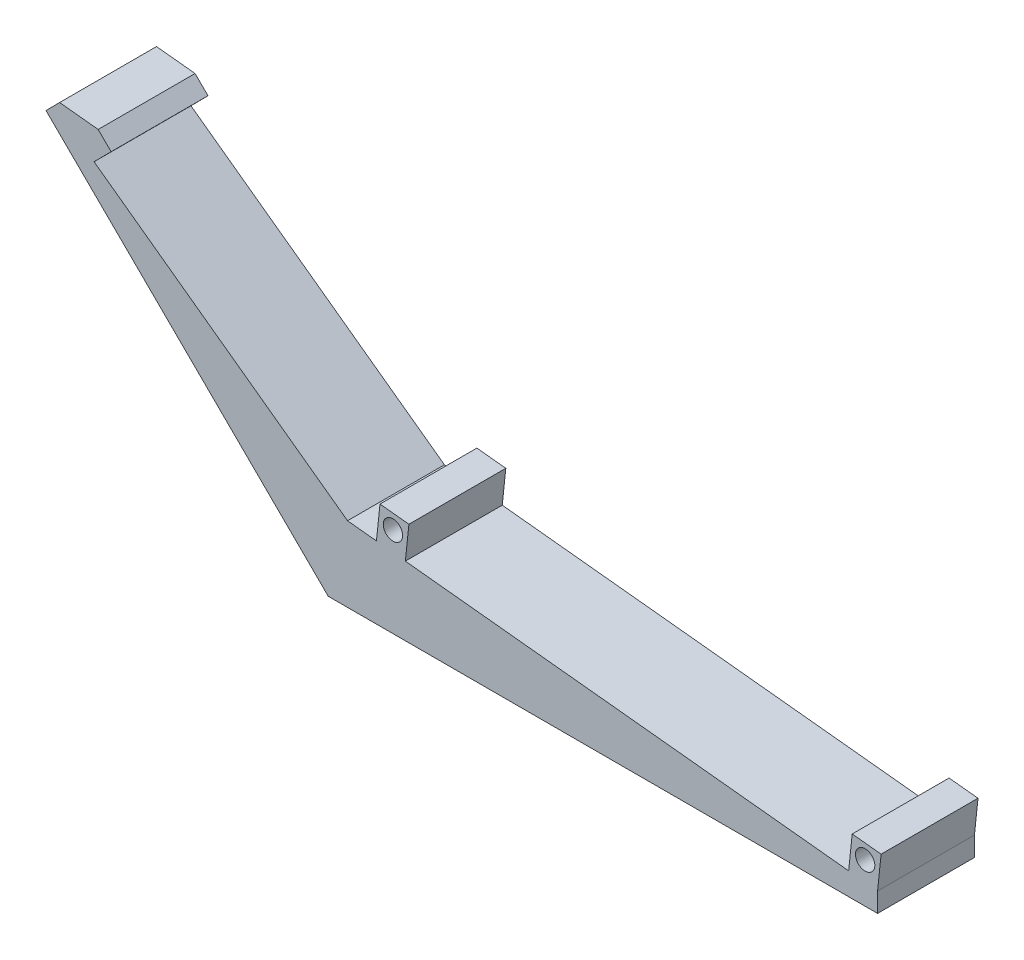
ISO-10303-21;
HEADER;
FILE_DESCRIPTION(('STEP AP214'),'2;1');
FILE_NAME('part.step','',(''),(''),'','','');
FILE_SCHEMA(('AUTOMOTIVE_DESIGN { 1 0 10303 214 1 1 1 1 }'));
ENDSEC;
DATA;
#1=APPLICATION_CONTEXT('core data for automotive mechanical design processes');
#2=APPLICATION_PROTOCOL_DEFINITION('international standard','automotive_design',2000,#1);
#3=PRODUCT_CONTEXT('',#1,'mechanical');
#4=PRODUCT('Part','Part','',(#3));
#5=PRODUCT_RELATED_PRODUCT_CATEGORY('part','',(#4));
#6=PRODUCT_DEFINITION_FORMATION('','',#4);
#7=PRODUCT_DEFINITION_CONTEXT('part definition',#1,'design');
#8=PRODUCT_DEFINITION('design','',#6,#7);
#9=PRODUCT_DEFINITION_SHAPE('','',#8);
#10=(LENGTH_UNIT() NAMED_UNIT(*) SI_UNIT(.MILLI.,.METRE.));
#11=(NAMED_UNIT(*) PLANE_ANGLE_UNIT() SI_UNIT($,.RADIAN.));
#12=(NAMED_UNIT(*) SI_UNIT($,.STERADIAN.) SOLID_ANGLE_UNIT());
#13=UNCERTAINTY_MEASURE_WITH_UNIT(LENGTH_MEASURE(1.E-05),#10,'distance_accuracy_value','');
#14=(GEOMETRIC_REPRESENTATION_CONTEXT(3) GLOBAL_UNCERTAINTY_ASSIGNED_CONTEXT((#13)) GLOBAL_UNIT_ASSIGNED_CONTEXT((#10,
#11,#12)) REPRESENTATION_CONTEXT('',''));
#15=CARTESIAN_POINT('',(0.,0.,0.));
#16=DIRECTION('',(0.,0.,1.));
#17=DIRECTION('',(1.,0.,0.));
#18=AXIS2_PLACEMENT_3D('',#15,#16,#17);
#19=CARTESIAN_POINT('',(0.,0.,10.));
#20=DIRECTION('',(0.,0.,1.));
#21=DIRECTION('',(1.,0.,0.));
#22=AXIS2_PLACEMENT_3D('',#19,#20,#21);
#23=PLANE('',#22);
#24=CARTESIAN_POINT('',(55.403938134922,4.14583648563804,10.));
#25=DIRECTION('',(0.,0.,1.));
#26=DIRECTION('',(1.,0.,0.));
#27=AXIS2_PLACEMENT_3D('',#24,#25,#26);
#28=CIRCLE('',#27,0.999999999999998);
#29=CARTESIAN_POINT('',(56.403938134922,4.14583648563804,10.));
#30=VERTEX_POINT('',#29);
#31=EDGE_CURVE('E183',#30,#30,#28,.T.);
#32=ORIENTED_EDGE('',*,*,#31,.F.);
#33=EDGE_LOOP('',(#32));
#34=FACE_BOUND('',#33,.T.);
#35=DIRECTION('',(0.71049553819604,-0.703701705414673,0.));
#36=VECTOR('',#35,1.);
#37=CARTESIAN_POINT('',(-29.1303170660377,28.8517699220016,10.));
#38=LINE('',#37,#36);
#39=CARTESIAN_POINT('',(-29.1303170660377,28.8517699220016,10.));
#40=VERTEX_POINT('',#39);
#41=CARTESIAN_POINT('',(0.,0.,10.));
#42=VERTEX_POINT('',#41);
#43=EDGE_CURVE('E214',#40,#42,#38,.T.);
#44=ORIENTED_EDGE('',*,*,#43,.T.);
#45=DIRECTION('',(1.,0.,0.));
#46=VECTOR('',#45,1.);
#47=CARTESIAN_POINT('',(0.,0.,10.));
#48=LINE('',#47,#46);
#49=CARTESIAN_POINT('',(56.6866640514391,0.,10.));
#50=VERTEX_POINT('',#49);
#51=EDGE_CURVE('E118',#42,#50,#48,.T.);
#52=ORIENTED_EDGE('',*,*,#51,.T.);
#53=DIRECTION('',(0.,1.,0.));
#54=VECTOR('',#53,1.);
#55=CARTESIAN_POINT('',(56.6866640514391,0.,10.));
#56=LINE('',#55,#54);
#57=CARTESIAN_POINT('',(56.6866640514391,2.,10.));
#58=VERTEX_POINT('',#57);
#59=EDGE_CURVE('E253',#50,#58,#56,.T.);
#60=ORIENTED_EDGE('',*,*,#59,.T.);
#61=DIRECTION('',(0.104528463267646,0.994521895368274,0.));
#62=VECTOR('',#61,1.);
#63=CARTESIAN_POINT('',(56.8957209779744,3.98904379073655,10.));
#64=LINE('',#63,#62);
#65=CARTESIAN_POINT('',(57.0525136728759,5.48082663378898,10.));
#66=VERTEX_POINT('',#65);
#67=EDGE_CURVE('E270',#58,#66,#64,.T.);
#68=ORIENTED_EDGE('',*,*,#67,.T.);
#69=DIRECTION('',(-0.994521895368274,0.104528463267647,0.));
#70=VECTOR('',#69,1.);
#71=CARTESIAN_POINT('',(54.0689479867711,5.79441202359192,10.));
#72=LINE('',#71,#70);
#73=CARTESIAN_POINT('',(54.0689479867711,5.79441202359192,10.));
#74=VERTEX_POINT('',#73);
#75=EDGE_CURVE('E267',#66,#74,#72,.T.);
#76=ORIENTED_EDGE('',*,*,#75,.T.);
#77=DIRECTION('',(-0.104528463267653,-0.994521895368273,0.));
#78=VECTOR('',#77,1.);
#79=CARTESIAN_POINT('',(53.9121552918696,4.30262918053952,10.));
#80=LINE('',#79,#78);
#81=CARTESIAN_POINT('',(53.7030983653343,2.31358538980296,10.));
#82=VERTEX_POINT('',#81);
#83=EDGE_CURVE('E269',#74,#82,#80,.T.);
#84=ORIENTED_EDGE('',*,*,#83,.T.);
#85=DIRECTION('',(-0.994521895368274,0.104528463267646,0.));
#86=VECTOR('',#85,1.);
#87=CARTESIAN_POINT('',(53.7030983653343,2.31358538980296,10.));
#88=LINE('',#87,#86);
#89=CARTESIAN_POINT('',(7.95509117839359,7.12189470011471,10.));
#90=VERTEX_POINT('',#89);
#91=EDGE_CURVE('E272',#82,#90,#88,.T.);
#92=ORIENTED_EDGE('',*,*,#91,.T.);
#93=DIRECTION('',(0.104528463267647,0.994521895368274,0.));
#94=VECTOR('',#93,1.);
#95=CARTESIAN_POINT('',(8.16414810492889,9.11093849085126,10.));
#96=LINE('',#95,#94);
#97=CARTESIAN_POINT('',(8.32094079983043,10.6027213339036,10.));
#98=VERTEX_POINT('',#97);
#99=EDGE_CURVE('E278',#90,#98,#96,.T.);
#100=ORIENTED_EDGE('',*,*,#99,.T.);
#101=DIRECTION('',(-0.994521895368274,0.104528463267645,0.));
#102=VECTOR('',#101,1.);
#103=CARTESIAN_POINT('',(5.33737511372561,10.9163067237066,10.));
#104=LINE('',#103,#102);
#105=CARTESIAN_POINT('',(5.33737511372561,10.9163067237066,10.));
#106=VERTEX_POINT('',#105);
#107=EDGE_CURVE('E280',#98,#106,#104,.T.);
#108=ORIENTED_EDGE('',*,*,#107,.T.);
#109=DIRECTION('',(-0.104528463267699,-0.994521895368269,0.));
#110=VECTOR('',#109,1.);
#111=CARTESIAN_POINT('',(5.18058241882406,9.42452388065419,10.));
#112=LINE('',#111,#110);
#113=CARTESIAN_POINT('',(4.97152549228877,7.43548008991765,10.));
#114=VERTEX_POINT('',#113);
#115=EDGE_CURVE('E282',#106,#114,#112,.T.);
#116=ORIENTED_EDGE('',*,*,#115,.T.);
#117=DIRECTION('',(-0.994521895368275,0.104528463267639,0.));
#118=VECTOR('',#117,1.);
#119=CARTESIAN_POINT('',(4.97152549228877,7.43548008991765,10.));
#120=LINE('',#119,#118);
#121=CARTESIAN_POINT('',(1.98795980618404,7.74906547972055,10.));
#122=VERTEX_POINT('',#121);
#123=EDGE_CURVE('E284',#114,#122,#120,.T.);
#124=ORIENTED_EDGE('',*,*,#123,.T.);
#125=DIRECTION('',(-0.809016994374951,0.587785252292468,0.));
#126=VECTOR('',#125,1.);
#127=CARTESIAN_POINT('',(1.98795980618404,7.74906547972055,10.));
#128=LINE('',#127,#126);
#129=CARTESIAN_POINT('',(-24.1704359642281,26.7542524713203,10.));
#130=VERTEX_POINT('',#129);
#131=EDGE_CURVE('E286',#122,#130,#128,.T.);
#132=ORIENTED_EDGE('',*,*,#131,.T.);
#133=DIRECTION('',(0.703701705414673,0.71049553819604,0.));
#134=VECTOR('',#133,1.);
#135=CARTESIAN_POINT('',(-24.1704359642281,26.7542524713203,10.));
#136=LINE('',#135,#134);
#137=CARTESIAN_POINT('',(-22.4111817006914,28.5304913168104,10.));
#138=VERTEX_POINT('',#137);
#139=EDGE_CURVE('E161',#130,#138,#136,.T.);
#140=ORIENTED_EDGE('',*,*,#139,.T.);
#141=DIRECTION('',(-0.71049553819604,0.703701705414673,0.));
#142=VECTOR('',#141,1.);
#143=CARTESIAN_POINT('',(-23.7464579497616,29.8529995144779,10.));
#144=LINE('',#143,#142);
#145=CARTESIAN_POINT('',(-23.7464579497616,29.8529995144779,10.));
#146=VERTEX_POINT('',#145);
#147=EDGE_CURVE('E155',#138,#146,#144,.T.);
#148=ORIENTED_EDGE('',*,*,#147,.T.);
#149=DIRECTION('',(-0.994521895368274,0.104528463267646,0.));
#150=VECTOR('',#149,1.);
#151=CARTESIAN_POINT('',(-27.7245455312347,30.2711133675484,10.));
#152=LINE('',#151,#150);
#153=CARTESIAN_POINT('',(-27.7245455312347,30.2711133675484,10.));
#154=VERTEX_POINT('',#153);
#155=EDGE_CURVE('E159',#146,#154,#152,.T.);
#156=ORIENTED_EDGE('',*,*,#155,.T.);
#157=DIRECTION('',(-0.703701705414674,-0.710495538196039,0.));
#158=VECTOR('',#157,1.);
#159=CARTESIAN_POINT('',(-29.1303170660377,28.8517699220016,10.));
#160=LINE('',#159,#158);
#161=EDGE_CURVE('E51',#154,#40,#160,.T.);
#162=ORIENTED_EDGE('',*,*,#161,.T.);
#163=EDGE_LOOP('',(#44,#52,#60,#68,#76,#84,#92,#100,#108,#116,#124,#132,#140,#148,#156,#162));
#164=FACE_BOUND('',#163,.T.);
#165=CARTESIAN_POINT('',(6.67236526187648,9.26773118575272,10.));
#166=DIRECTION('',(0.,0.,1.));
#167=DIRECTION('',(1.,0.,0.));
#168=AXIS2_PLACEMENT_3D('',#165,#166,#167);
#169=CIRCLE('',#168,1.);
#170=CARTESIAN_POINT('',(7.67236526187648,9.26773118575272,10.));
#171=VERTEX_POINT('',#170);
#172=EDGE_CURVE('E328',#171,#171,#169,.T.);
#173=ORIENTED_EDGE('',*,*,#172,.F.);
#174=EDGE_LOOP('',(#173));
#175=FACE_BOUND('',#174,.T.);
#176=ADVANCED_FACE('F34',(#34,#164,#175),#23,.T.);
#177=CARTESIAN_POINT('',(0.,0.,0.));
#178=DIRECTION('',(0.,0.,1.));
#179=DIRECTION('',(1.,0.,0.));
#180=AXIS2_PLACEMENT_3D('',#177,#178,#179);
#181=PLANE('',#180);
#182=DIRECTION('',(0.71049553819604,-0.703701705414673,0.));
#183=VECTOR('',#182,1.);
#184=CARTESIAN_POINT('',(-29.1303170660377,28.8517699220016,0.));
#185=LINE('',#184,#183);
#186=CARTESIAN_POINT('',(-29.1303170660377,28.8517699220016,0.));
#187=VERTEX_POINT('',#186);
#188=CARTESIAN_POINT('',(0.,0.,0.));
#189=VERTEX_POINT('',#188);
#190=EDGE_CURVE('E179',#187,#189,#185,.T.);
#191=ORIENTED_EDGE('',*,*,#190,.F.);
#192=DIRECTION('',(-0.703701705414674,-0.710495538196039,0.));
#193=VECTOR('',#192,1.);
#194=CARTESIAN_POINT('',(-29.1303170660377,28.8517699220016,0.));
#195=LINE('',#194,#193);
#196=CARTESIAN_POINT('',(-27.7245455312347,30.2711133675484,0.));
#197=VERTEX_POINT('',#196);
#198=EDGE_CURVE('E110',#197,#187,#195,.T.);
#199=ORIENTED_EDGE('',*,*,#198,.F.);
#200=DIRECTION('',(-0.994521895368274,0.104528463267646,0.));
#201=VECTOR('',#200,1.);
#202=CARTESIAN_POINT('',(-27.7245455312347,30.2711133675484,0.));
#203=LINE('',#202,#201);
#204=CARTESIAN_POINT('',(-23.7464579497616,29.8529995144779,0.));
#205=VERTEX_POINT('',#204);
#206=EDGE_CURVE('E104',#205,#197,#203,.T.);
#207=ORIENTED_EDGE('',*,*,#206,.F.);
#208=DIRECTION('',(-0.71049553819604,0.703701705414673,0.));
#209=VECTOR('',#208,1.);
#210=CARTESIAN_POINT('',(-23.7464579497616,29.8529995144779,0.));
#211=LINE('',#210,#209);
#212=CARTESIAN_POINT('',(-22.4111817006914,28.5304913168104,0.));
#213=VERTEX_POINT('',#212);
#214=EDGE_CURVE('E169',#213,#205,#211,.T.);
#215=ORIENTED_EDGE('',*,*,#214,.F.);
#216=DIRECTION('',(0.703701705414673,0.71049553819604,0.));
#217=VECTOR('',#216,1.);
#218=CARTESIAN_POINT('',(-24.1704359642281,26.7542524713203,0.));
#219=LINE('',#218,#217);
#220=CARTESIAN_POINT('',(-24.1704359642281,26.7542524713203,0.));
#221=VERTEX_POINT('',#220);
#222=EDGE_CURVE('E209',#221,#213,#219,.T.);
#223=ORIENTED_EDGE('',*,*,#222,.F.);
#224=DIRECTION('',(-0.809016994374951,0.587785252292468,0.));
#225=VECTOR('',#224,1.);
#226=CARTESIAN_POINT('',(1.98795980618404,7.74906547972055,0.));
#227=LINE('',#226,#225);
#228=CARTESIAN_POINT('',(1.98795980618404,7.74906547972055,0.));
#229=VERTEX_POINT('',#228);
#230=EDGE_CURVE('E207',#229,#221,#227,.T.);
#231=ORIENTED_EDGE('',*,*,#230,.F.);
#232=DIRECTION('',(-0.994521895368275,0.104528463267639,0.));
#233=VECTOR('',#232,1.);
#234=CARTESIAN_POINT('',(4.97152549228877,7.43548008991765,0.));
#235=LINE('',#234,#233);
#236=CARTESIAN_POINT('',(4.97152549228877,7.43548008991765,0.));
#237=VERTEX_POINT('',#236);
#238=EDGE_CURVE('E205',#237,#229,#235,.T.);
#239=ORIENTED_EDGE('',*,*,#238,.F.);
#240=DIRECTION('',(-0.104528463267646,-0.994521895368274,0.));
#241=VECTOR('',#240,1.);
#242=CARTESIAN_POINT('',(4.97152549228877,7.43548008991765,0.));
#243=LINE('',#242,#241);
#244=CARTESIAN_POINT('',(5.33737511372561,10.9163067237066,0.));
#245=VERTEX_POINT('',#244);
#246=EDGE_CURVE('E203',#245,#237,#243,.T.);
#247=ORIENTED_EDGE('',*,*,#246,.F.);
#248=DIRECTION('',(-0.994521895368274,0.104528463267645,0.));
#249=VECTOR('',#248,1.);
#250=CARTESIAN_POINT('',(5.33737511372561,10.9163067237066,0.));
#251=LINE('',#250,#249);
#252=CARTESIAN_POINT('',(8.32094079983043,10.6027213339036,0.));
#253=VERTEX_POINT('',#252);
#254=EDGE_CURVE('E200',#253,#245,#251,.T.);
#255=ORIENTED_EDGE('',*,*,#254,.F.);
#256=DIRECTION('',(0.104528463267698,0.994521895368269,0.));
#257=VECTOR('',#256,1.);
#258=CARTESIAN_POINT('',(8.32094079983043,10.6027213339036,0.));
#259=LINE('',#258,#257);
#260=CARTESIAN_POINT('',(7.95509117839359,7.12189470011471,0.));
#261=VERTEX_POINT('',#260);
#262=EDGE_CURVE('E198',#261,#253,#259,.T.);
#263=ORIENTED_EDGE('',*,*,#262,.F.);
#264=DIRECTION('',(-0.994521895368274,0.104528463267646,0.));
#265=VECTOR('',#264,1.);
#266=CARTESIAN_POINT('',(53.7030983653343,2.31358538980296,0.));
#267=LINE('',#266,#265);
#268=CARTESIAN_POINT('',(53.7030983653343,2.31358538980296,0.));
#269=VERTEX_POINT('',#268);
#270=EDGE_CURVE('E195',#269,#261,#267,.T.);
#271=ORIENTED_EDGE('',*,*,#270,.F.);
#272=DIRECTION('',(-0.104528463267646,-0.994521895368274,0.));
#273=VECTOR('',#272,1.);
#274=CARTESIAN_POINT('',(53.7030983653343,2.31358538980296,0.));
#275=LINE('',#274,#273);
#276=CARTESIAN_POINT('',(54.0689479867711,5.79441202359192,0.));
#277=VERTEX_POINT('',#276);
#278=EDGE_CURVE('E193',#277,#269,#275,.T.);
#279=ORIENTED_EDGE('',*,*,#278,.F.);
#280=DIRECTION('',(-0.994521895368274,0.104528463267647,0.));
#281=VECTOR('',#280,1.);
#282=CARTESIAN_POINT('',(54.0689479867711,5.79441202359192,0.));
#283=LINE('',#282,#281);
#284=CARTESIAN_POINT('',(57.0525136728759,5.48082663378898,0.));
#285=VERTEX_POINT('',#284);
#286=EDGE_CURVE('E190',#285,#277,#283,.T.);
#287=ORIENTED_EDGE('',*,*,#286,.F.);
#288=DIRECTION('',(0.104528463267647,0.994521895368274,0.));
#289=VECTOR('',#288,1.);
#290=CARTESIAN_POINT('',(57.0525136728759,5.48082663378898,0.));
#291=LINE('',#290,#289);
#292=CARTESIAN_POINT('',(56.6866640514391,2.,0.));
#293=VERTEX_POINT('',#292);
#294=EDGE_CURVE('E188',#293,#285,#291,.T.);
#295=ORIENTED_EDGE('',*,*,#294,.F.);
#296=DIRECTION('',(0.,1.,0.));
#297=VECTOR('',#296,1.);
#298=CARTESIAN_POINT('',(56.6866640514391,0.,0.));
#299=LINE('',#298,#297);
#300=CARTESIAN_POINT('',(56.6866640514391,0.,0.));
#301=VERTEX_POINT('',#300);
#302=EDGE_CURVE('E185',#301,#293,#299,.T.);
#303=ORIENTED_EDGE('',*,*,#302,.F.);
#304=DIRECTION('',(1.,0.,0.));
#305=VECTOR('',#304,1.);
#306=CARTESIAN_POINT('',(0.,0.,0.));
#307=LINE('',#306,#305);
#308=EDGE_CURVE('E182',#189,#301,#307,.T.);
#309=ORIENTED_EDGE('',*,*,#308,.F.);
#310=EDGE_LOOP('',(#191,#199,#207,#215,#223,#231,#239,#247,#255,#263,#271,#279,#287,#295,#303,#309));
#311=FACE_BOUND('',#310,.T.);
#312=CARTESIAN_POINT('',(55.403938134922,4.14583648563804,0.));
#313=DIRECTION('',(0.,0.,1.));
#314=DIRECTION('',(1.,0.,0.));
#315=AXIS2_PLACEMENT_3D('',#312,#313,#314);
#316=CIRCLE('',#315,0.999999999999998);
#317=CARTESIAN_POINT('',(56.403938134922,4.14583648563804,0.));
#318=VERTEX_POINT('',#317);
#319=EDGE_CURVE('E334',#318,#318,#316,.T.);
#320=ORIENTED_EDGE('',*,*,#319,.T.);
#321=EDGE_LOOP('',(#320));
#322=FACE_BOUND('',#321,.T.);
#323=CARTESIAN_POINT('',(6.67236526187648,9.26773118575272,0.));
#324=DIRECTION('',(0.,0.,1.));
#325=DIRECTION('',(1.,0.,0.));
#326=AXIS2_PLACEMENT_3D('',#323,#324,#325);
#327=CIRCLE('',#326,1.);
#328=CARTESIAN_POINT('',(7.67236526187648,9.26773118575272,0.));
#329=VERTEX_POINT('',#328);
#330=EDGE_CURVE('E331',#329,#329,#327,.T.);
#331=ORIENTED_EDGE('',*,*,#330,.T.);
#332=EDGE_LOOP('',(#331));
#333=FACE_BOUND('',#332,.T.);
#334=ADVANCED_FACE('F256',(#311,#322,#333),#181,.F.);
#335=CARTESIAN_POINT('',(-29.1303170660377,28.8517699220016,10.));
#336=DIRECTION('',(0.703701705414673,0.71049553819604,0.));
#337=DIRECTION('',(-0.71049553819604,0.703701705414673,0.));
#338=AXIS2_PLACEMENT_3D('',#335,#336,#337);
#339=PLANE('',#338);
#340=ORIENTED_EDGE('',*,*,#190,.T.);
#341=DIRECTION('',(0.,0.,-1.));
#342=VECTOR('',#341,1.);
#343=CARTESIAN_POINT('',(0.,0.,10.));
#344=LINE('',#343,#342);
#345=EDGE_CURVE('E11',#42,#189,#344,.T.);
#346=ORIENTED_EDGE('',*,*,#345,.F.);
#347=ORIENTED_EDGE('',*,*,#43,.F.);
#348=DIRECTION('',(0.,0.,-1.));
#349=VECTOR('',#348,1.);
#350=CARTESIAN_POINT('',(-29.1303170660377,28.8517699220016,10.));
#351=LINE('',#350,#349);
#352=EDGE_CURVE('E175',#40,#187,#351,.T.);
#353=ORIENTED_EDGE('',*,*,#352,.T.);
#354=EDGE_LOOP('',(#340,#346,#347,#353));
#355=FACE_BOUND('',#354,.T.);
#356=ADVANCED_FACE('F36',(#355),#339,.F.);
#357=CARTESIAN_POINT('',(0.,0.,10.));
#358=DIRECTION('',(0.,1.,0.));
#359=DIRECTION('',(0.,0.,1.));
#360=AXIS2_PLACEMENT_3D('',#357,#358,#359);
#361=PLANE('',#360);
#362=ORIENTED_EDGE('',*,*,#308,.T.);
#363=DIRECTION('',(0.,0.,-1.));
#364=VECTOR('',#363,1.);
#365=CARTESIAN_POINT('',(56.6866640514391,0.,10.));
#366=LINE('',#365,#364);
#367=EDGE_CURVE('E43',#50,#301,#366,.T.);
#368=ORIENTED_EDGE('',*,*,#367,.F.);
#369=ORIENTED_EDGE('',*,*,#51,.F.);
#370=ORIENTED_EDGE('',*,*,#345,.T.);
#371=EDGE_LOOP('',(#362,#368,#369,#370));
#372=FACE_BOUND('',#371,.T.);
#373=ADVANCED_FACE('F471',(#372),#361,.F.);
#374=CARTESIAN_POINT('',(56.6866640514391,0.,10.));
#375=DIRECTION('',(-1.,0.,0.));
#376=DIRECTION('',(0.,0.,1.));
#377=AXIS2_PLACEMENT_3D('',#374,#375,#376);
#378=PLANE('',#377);
#379=ORIENTED_EDGE('',*,*,#302,.T.);
#380=DIRECTION('',(0.,0.,-1.));
#381=VECTOR('',#380,1.);
#382=CARTESIAN_POINT('',(56.6866640514391,2.,10.));
#383=LINE('',#382,#381);
#384=EDGE_CURVE('E245',#58,#293,#383,.T.);
#385=ORIENTED_EDGE('',*,*,#384,.F.);
#386=ORIENTED_EDGE('',*,*,#59,.F.);
#387=ORIENTED_EDGE('',*,*,#367,.T.);
#388=EDGE_LOOP('',(#379,#385,#386,#387));
#389=FACE_BOUND('',#388,.T.);
#390=ADVANCED_FACE('F251',(#389),#378,.F.);
#391=CARTESIAN_POINT('',(57.0525136728759,5.48082663378898,10.));
#392=DIRECTION('',(-0.994521895368274,0.104528463267647,0.));
#393=DIRECTION('',(-0.104528463267647,-0.994521895368274,0.));
#394=AXIS2_PLACEMENT_3D('',#391,#392,#393);
#395=PLANE('',#394);
#396=ORIENTED_EDGE('',*,*,#294,.T.);
#397=DIRECTION('',(0.,0.,-1.));
#398=VECTOR('',#397,1.);
#399=CARTESIAN_POINT('',(57.0525136728759,5.48082663378898,10.));
#400=LINE('',#399,#398);
#401=EDGE_CURVE('E242',#66,#285,#400,.T.);
#402=ORIENTED_EDGE('',*,*,#401,.F.);
#403=ORIENTED_EDGE('',*,*,#67,.F.);
#404=ORIENTED_EDGE('',*,*,#384,.T.);
#405=EDGE_LOOP('',(#396,#402,#403,#404));
#406=FACE_BOUND('',#405,.T.);
#407=ADVANCED_FACE('F261',(#406),#395,.F.);
#408=CARTESIAN_POINT('',(54.0689479867711,5.79441202359192,10.));
#409=DIRECTION('',(-0.104528463267647,-0.994521895368274,0.));
#410=DIRECTION('',(0.994521895368274,-0.104528463267647,0.));
#411=AXIS2_PLACEMENT_3D('',#408,#409,#410);
#412=PLANE('',#411);
#413=ORIENTED_EDGE('',*,*,#286,.T.);
#414=DIRECTION('',(0.,0.,-1.));
#415=VECTOR('',#414,1.);
#416=CARTESIAN_POINT('',(54.0689479867711,5.79441202359192,10.));
#417=LINE('',#416,#415);
#418=EDGE_CURVE('E239',#74,#277,#417,.T.);
#419=ORIENTED_EDGE('',*,*,#418,.F.);
#420=ORIENTED_EDGE('',*,*,#75,.F.);
#421=ORIENTED_EDGE('',*,*,#401,.T.);
#422=EDGE_LOOP('',(#413,#419,#420,#421));
#423=FACE_BOUND('',#422,.T.);
#424=ADVANCED_FACE('F265',(#423),#412,.F.);
#425=CARTESIAN_POINT('',(53.7030983653343,2.31358538980296,10.));
#426=DIRECTION('',(0.994521895368274,-0.104528463267646,0.));
#427=DIRECTION('',(0.104528463267646,0.994521895368274,0.));
#428=AXIS2_PLACEMENT_3D('',#425,#426,#427);
#429=PLANE('',#428);
#430=ORIENTED_EDGE('',*,*,#278,.T.);
#431=DIRECTION('',(0.,0.,-1.));
#432=VECTOR('',#431,1.);
#433=CARTESIAN_POINT('',(53.7030983653343,2.31358538980296,10.));
#434=LINE('',#433,#432);
#435=EDGE_CURVE('E236',#82,#269,#434,.T.);
#436=ORIENTED_EDGE('',*,*,#435,.F.);
#437=ORIENTED_EDGE('',*,*,#83,.F.);
#438=ORIENTED_EDGE('',*,*,#418,.T.);
#439=EDGE_LOOP('',(#430,#436,#437,#438));
#440=FACE_BOUND('',#439,.T.);
#441=ADVANCED_FACE('F434',(#440),#429,.F.);
#442=CARTESIAN_POINT('',(53.7030983653343,2.31358538980296,10.));
#443=DIRECTION('',(-0.104528463267646,-0.994521895368274,0.));
#444=DIRECTION('',(0.994521895368274,-0.104528463267646,0.));
#445=AXIS2_PLACEMENT_3D('',#442,#443,#444);
#446=PLANE('',#445);
#447=ORIENTED_EDGE('',*,*,#270,.T.);
#448=DIRECTION('',(0.,0.,-1.));
#449=VECTOR('',#448,1.);
#450=CARTESIAN_POINT('',(7.95509117839359,7.12189470011471,10.));
#451=LINE('',#450,#449);
#452=EDGE_CURVE('E233',#90,#261,#451,.T.);
#453=ORIENTED_EDGE('',*,*,#452,.F.);
#454=ORIENTED_EDGE('',*,*,#91,.F.);
#455=ORIENTED_EDGE('',*,*,#435,.T.);
#456=EDGE_LOOP('',(#447,#453,#454,#455));
#457=FACE_BOUND('',#456,.T.);
#458=ADVANCED_FACE('F423',(#457),#446,.F.);
#459=CARTESIAN_POINT('',(8.32094079983043,10.6027213339036,10.));
#460=DIRECTION('',(-0.994521895368269,0.104528463267698,0.));
#461=DIRECTION('',(-0.104528463267698,-0.994521895368269,0.));
#462=AXIS2_PLACEMENT_3D('',#459,#460,#461);
#463=PLANE('',#462);
#464=ORIENTED_EDGE('',*,*,#262,.T.);
#465=DIRECTION('',(0.,0.,-1.));
#466=VECTOR('',#465,1.);
#467=CARTESIAN_POINT('',(8.32094079983043,10.6027213339036,10.));
#468=LINE('',#467,#466);
#469=EDGE_CURVE('E230',#98,#253,#468,.T.);
#470=ORIENTED_EDGE('',*,*,#469,.F.);
#471=ORIENTED_EDGE('',*,*,#99,.F.);
#472=ORIENTED_EDGE('',*,*,#452,.T.);
#473=EDGE_LOOP('',(#464,#470,#471,#472));
#474=FACE_BOUND('',#473,.T.);
#475=ADVANCED_FACE('F413',(#474),#463,.F.);
#476=CARTESIAN_POINT('',(5.33737511372561,10.9163067237066,10.));
#477=DIRECTION('',(-0.104528463267645,-0.994521895368274,0.));
#478=DIRECTION('',(0.994521895368274,-0.104528463267645,0.));
#479=AXIS2_PLACEMENT_3D('',#476,#477,#478);
#480=PLANE('',#479);
#481=ORIENTED_EDGE('',*,*,#254,.T.);
#482=DIRECTION('',(0.,0.,-1.));
#483=VECTOR('',#482,1.);
#484=CARTESIAN_POINT('',(5.33737511372561,10.9163067237066,10.));
#485=LINE('',#484,#483);
#486=EDGE_CURVE('E227',#106,#245,#485,.T.);
#487=ORIENTED_EDGE('',*,*,#486,.F.);
#488=ORIENTED_EDGE('',*,*,#107,.F.);
#489=ORIENTED_EDGE('',*,*,#469,.T.);
#490=EDGE_LOOP('',(#481,#487,#488,#489));
#491=FACE_BOUND('',#490,.T.);
#492=ADVANCED_FACE('F402',(#491),#480,.F.);
#493=CARTESIAN_POINT('',(4.97152549228877,7.43548008991765,10.));
#494=DIRECTION('',(0.994521895368274,-0.104528463267646,0.));
#495=DIRECTION('',(0.104528463267646,0.994521895368274,0.));
#496=AXIS2_PLACEMENT_3D('',#493,#494,#495);
#497=PLANE('',#496);
#498=ORIENTED_EDGE('',*,*,#246,.T.);
#499=DIRECTION('',(0.,0.,-1.));
#500=VECTOR('',#499,1.);
#501=CARTESIAN_POINT('',(4.97152549228877,7.43548008991765,10.));
#502=LINE('',#501,#500);
#503=EDGE_CURVE('E224',#114,#237,#502,.T.);
#504=ORIENTED_EDGE('',*,*,#503,.F.);
#505=ORIENTED_EDGE('',*,*,#115,.F.);
#506=ORIENTED_EDGE('',*,*,#486,.T.);
#507=EDGE_LOOP('',(#498,#504,#505,#506));
#508=FACE_BOUND('',#507,.T.);
#509=ADVANCED_FACE('F392',(#508),#497,.F.);
#510=CARTESIAN_POINT('',(4.97152549228877,7.43548008991765,10.));
#511=DIRECTION('',(-0.104528463267639,-0.994521895368275,0.));
#512=DIRECTION('',(0.994521895368275,-0.104528463267639,0.));
#513=AXIS2_PLACEMENT_3D('',#510,#511,#512);
#514=PLANE('',#513);
#515=ORIENTED_EDGE('',*,*,#238,.T.);
#516=DIRECTION('',(0.,0.,-1.));
#517=VECTOR('',#516,1.);
#518=CARTESIAN_POINT('',(1.98795980618404,7.74906547972055,10.));
#519=LINE('',#518,#517);
#520=EDGE_CURVE('E221',#122,#229,#519,.T.);
#521=ORIENTED_EDGE('',*,*,#520,.F.);
#522=ORIENTED_EDGE('',*,*,#123,.F.);
#523=ORIENTED_EDGE('',*,*,#503,.T.);
#524=EDGE_LOOP('',(#515,#521,#522,#523));
#525=FACE_BOUND('',#524,.T.);
#526=ADVANCED_FACE('F383',(#525),#514,.F.);
#527=CARTESIAN_POINT('',(1.98795980618404,7.74906547972055,10.));
#528=DIRECTION('',(-0.587785252292468,-0.809016994374951,0.));
#529=DIRECTION('',(0.809016994374951,-0.587785252292468,0.));
#530=AXIS2_PLACEMENT_3D('',#527,#528,#529);
#531=PLANE('',#530);
#532=ORIENTED_EDGE('',*,*,#230,.T.);
#533=DIRECTION('',(0.,0.,-1.));
#534=VECTOR('',#533,1.);
#535=CARTESIAN_POINT('',(-24.1704359642281,26.7542524713203,10.));
#536=LINE('',#535,#534);
#537=EDGE_CURVE('E218',#130,#221,#536,.T.);
#538=ORIENTED_EDGE('',*,*,#537,.F.);
#539=ORIENTED_EDGE('',*,*,#131,.F.);
#540=ORIENTED_EDGE('',*,*,#520,.T.);
#541=EDGE_LOOP('',(#532,#538,#539,#540));
#542=FACE_BOUND('',#541,.T.);
#543=ADVANCED_FACE('F292',(#542),#531,.F.);
#544=CARTESIAN_POINT('',(-24.1704359642281,26.7542524713203,10.));
#545=DIRECTION('',(-0.71049553819604,0.703701705414673,0.));
#546=DIRECTION('',(-0.703701705414673,-0.71049553819604,0.));
#547=AXIS2_PLACEMENT_3D('',#544,#545,#546);
#548=PLANE('',#547);
#549=ORIENTED_EDGE('',*,*,#222,.T.);
#550=DIRECTION('',(0.,0.,-1.));
#551=VECTOR('',#550,1.);
#552=CARTESIAN_POINT('',(-22.4111817006914,28.5304913168104,10.));
#553=LINE('',#552,#551);
#554=EDGE_CURVE('E170',#138,#213,#553,.T.);
#555=ORIENTED_EDGE('',*,*,#554,.F.);
#556=ORIENTED_EDGE('',*,*,#139,.F.);
#557=ORIENTED_EDGE('',*,*,#537,.T.);
#558=EDGE_LOOP('',(#549,#555,#556,#557));
#559=FACE_BOUND('',#558,.T.);
#560=ADVANCED_FACE('F296',(#559),#548,.F.);
#561=CARTESIAN_POINT('',(-23.7464579497616,29.8529995144779,10.));
#562=DIRECTION('',(-0.703701705414673,-0.71049553819604,0.));
#563=DIRECTION('',(0.71049553819604,-0.703701705414673,0.));
#564=AXIS2_PLACEMENT_3D('',#561,#562,#563);
#565=PLANE('',#564);
#566=ORIENTED_EDGE('',*,*,#214,.T.);
#567=DIRECTION('',(0.,0.,-1.));
#568=VECTOR('',#567,1.);
#569=CARTESIAN_POINT('',(-23.7464579497616,29.8529995144779,10.));
#570=LINE('',#569,#568);
#571=EDGE_CURVE('E166',#146,#205,#570,.T.);
#572=ORIENTED_EDGE('',*,*,#571,.F.);
#573=ORIENTED_EDGE('',*,*,#147,.F.);
#574=ORIENTED_EDGE('',*,*,#554,.T.);
#575=EDGE_LOOP('',(#566,#572,#573,#574));
#576=FACE_BOUND('',#575,.T.);
#577=ADVANCED_FACE('F167',(#576),#565,.F.);
#578=CARTESIAN_POINT('',(-27.7245455312347,30.2711133675484,10.));
#579=DIRECTION('',(-0.104528463267646,-0.994521895368274,0.));
#580=DIRECTION('',(0.994521895368274,-0.104528463267646,0.));
#581=AXIS2_PLACEMENT_3D('',#578,#579,#580);
#582=PLANE('',#581);
#583=ORIENTED_EDGE('',*,*,#206,.T.);
#584=DIRECTION('',(0.,0.,-1.));
#585=VECTOR('',#584,1.);
#586=CARTESIAN_POINT('',(-27.7245455312347,30.2711133675484,10.));
#587=LINE('',#586,#585);
#588=EDGE_CURVE('E171',#154,#197,#587,.T.);
#589=ORIENTED_EDGE('',*,*,#588,.F.);
#590=ORIENTED_EDGE('',*,*,#155,.F.);
#591=ORIENTED_EDGE('',*,*,#571,.T.);
#592=EDGE_LOOP('',(#583,#589,#590,#591));
#593=FACE_BOUND('',#592,.T.);
#594=ADVANCED_FACE('F173',(#593),#582,.F.);
#595=CARTESIAN_POINT('',(-29.1303170660377,28.8517699220016,10.));
#596=DIRECTION('',(0.710495538196039,-0.703701705414674,0.));
#597=DIRECTION('',(0.703701705414674,0.710495538196039,0.));
#598=AXIS2_PLACEMENT_3D('',#595,#596,#597);
#599=PLANE('',#598);
#600=ORIENTED_EDGE('',*,*,#198,.T.);
#601=ORIENTED_EDGE('',*,*,#352,.F.);
#602=ORIENTED_EDGE('',*,*,#161,.F.);
#603=ORIENTED_EDGE('',*,*,#588,.T.);
#604=EDGE_LOOP('',(#600,#601,#602,#603));
#605=FACE_BOUND('',#604,.T.);
#606=ADVANCED_FACE('F300',(#605),#599,.F.);
#607=CARTESIAN_POINT('',(55.403938134922,4.14583648563804,10.));
#608=DIRECTION('',(0.,0.,-1.));
#609=DIRECTION('',(-1.,0.,0.));
#610=AXIS2_PLACEMENT_3D('',#607,#608,#609);
#611=CYLINDRICAL_SURFACE('',#610,0.999999999999998);
#612=ORIENTED_EDGE('',*,*,#31,.T.);
#613=EDGE_LOOP('',(#612));
#614=FACE_BOUND('',#613,.T.);
#615=ORIENTED_EDGE('',*,*,#319,.F.);
#616=EDGE_LOOP('',(#615));
#617=FACE_BOUND('',#616,.T.);
#618=ADVANCED_FACE('F302',(#614,#617),#611,.F.);
#619=CARTESIAN_POINT('',(6.67236526187648,9.26773118575272,10.));
#620=DIRECTION('',(0.,0.,-1.));
#621=DIRECTION('',(-1.,0.,0.));
#622=AXIS2_PLACEMENT_3D('',#619,#620,#621);
#623=CYLINDRICAL_SURFACE('',#622,1.);
#624=ORIENTED_EDGE('',*,*,#172,.T.);
#625=EDGE_LOOP('',(#624));
#626=FACE_BOUND('',#625,.T.);
#627=ORIENTED_EDGE('',*,*,#330,.F.);
#628=EDGE_LOOP('',(#627));
#629=FACE_BOUND('',#628,.T.);
#630=ADVANCED_FACE('F308',(#626,#629),#623,.F.);
#631=CLOSED_SHELL('',(#176,#334,#356,#373,#390,#407,#424,#441,#458,#475,#492,#509,#526,#543,
#560,#577,#594,#606,#618,#630));
#632=MANIFOLD_SOLID_BREP('B2',#631);
#633=ADVANCED_BREP_SHAPE_REPRESENTATION('',(#18,#632),#14);
#634=SHAPE_DEFINITION_REPRESENTATION(#9,#633);
ENDSEC;
END-ISO-10303-21;
